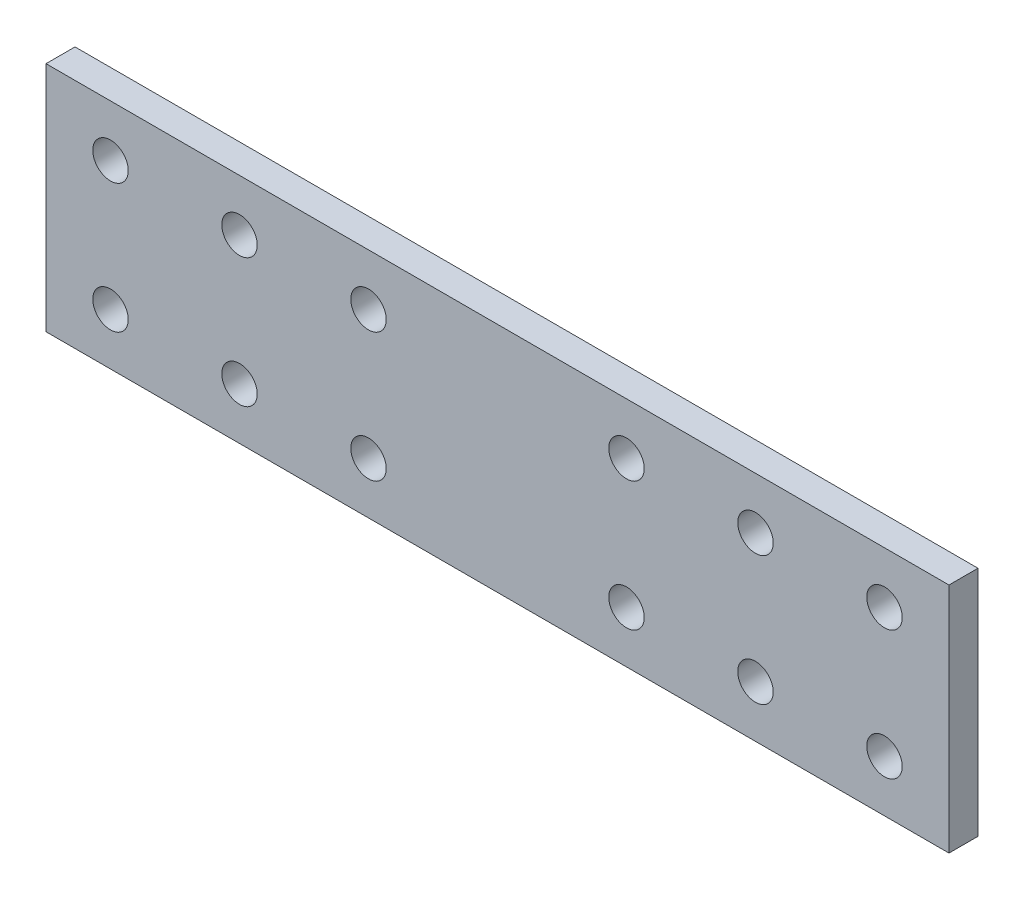
ISO-10303-21;
HEADER;
FILE_DESCRIPTION(('STEP AP214'),'2;1');
FILE_NAME('part.step','',(''),(''),'','','');
FILE_SCHEMA(('AUTOMOTIVE_DESIGN { 1 0 10303 214 1 1 1 1 }'));
ENDSEC;
DATA;
#1=APPLICATION_CONTEXT('core data for automotive mechanical design processes');
#2=APPLICATION_PROTOCOL_DEFINITION('international standard','automotive_design',2000,#1);
#3=PRODUCT_CONTEXT('',#1,'mechanical');
#4=PRODUCT('Part','Part','',(#3));
#5=PRODUCT_RELATED_PRODUCT_CATEGORY('part','',(#4));
#6=PRODUCT_DEFINITION_FORMATION('','',#4);
#7=PRODUCT_DEFINITION_CONTEXT('part definition',#1,'design');
#8=PRODUCT_DEFINITION('design','',#6,#7);
#9=PRODUCT_DEFINITION_SHAPE('','',#8);
#10=(LENGTH_UNIT() NAMED_UNIT(*) SI_UNIT(.MILLI.,.METRE.));
#11=(NAMED_UNIT(*) PLANE_ANGLE_UNIT() SI_UNIT($,.RADIAN.));
#12=(NAMED_UNIT(*) SI_UNIT($,.STERADIAN.) SOLID_ANGLE_UNIT());
#13=UNCERTAINTY_MEASURE_WITH_UNIT(LENGTH_MEASURE(1.E-05),#10,'distance_accuracy_value','');
#14=(GEOMETRIC_REPRESENTATION_CONTEXT(3) GLOBAL_UNCERTAINTY_ASSIGNED_CONTEXT((#13)) GLOBAL_UNIT_ASSIGNED_CONTEXT((#10,
#11,#12)) REPRESENTATION_CONTEXT('',''));
#15=CARTESIAN_POINT('',(0.,0.,0.));
#16=DIRECTION('',(0.,0.,1.));
#17=DIRECTION('',(1.,0.,0.));
#18=AXIS2_PLACEMENT_3D('',#15,#16,#17);
#19=CARTESIAN_POINT('',(0.,0.,18.));
#20=DIRECTION('',(1.,0.,0.));
#21=DIRECTION('',(0.,0.,-1.));
#22=AXIS2_PLACEMENT_3D('',#19,#20,#21);
#23=PLANE('',#22);
#24=DIRECTION('',(0.,-1.,0.));
#25=VECTOR('',#24,1.);
#26=CARTESIAN_POINT('',(0.,0.,0.));
#27=LINE('',#26,#25);
#28=CARTESIAN_POINT('',(0.,144.,0.));
#29=VERTEX_POINT('',#28);
#30=CARTESIAN_POINT('',(0.,0.,0.));
#31=VERTEX_POINT('',#30);
#32=EDGE_CURVE('E103',#29,#31,#27,.T.);
#33=ORIENTED_EDGE('',*,*,#32,.T.);
#34=DIRECTION('',(0.,0.,-1.));
#35=VECTOR('',#34,1.);
#36=CARTESIAN_POINT('',(0.,0.,18.));
#37=LINE('',#36,#35);
#38=CARTESIAN_POINT('',(0.,0.,18.));
#39=VERTEX_POINT('',#38);
#40=EDGE_CURVE('E94',#39,#31,#37,.T.);
#41=ORIENTED_EDGE('',*,*,#40,.F.);
#42=DIRECTION('',(0.,-1.,0.));
#43=VECTOR('',#42,1.);
#44=CARTESIAN_POINT('',(0.,0.,18.));
#45=LINE('',#44,#43);
#46=CARTESIAN_POINT('',(0.,144.,18.));
#47=VERTEX_POINT('',#46);
#48=EDGE_CURVE('E88',#47,#39,#45,.T.);
#49=ORIENTED_EDGE('',*,*,#48,.F.);
#50=DIRECTION('',(0.,0.,-1.));
#51=VECTOR('',#50,1.);
#52=CARTESIAN_POINT('',(0.,144.,18.));
#53=LINE('',#52,#51);
#54=EDGE_CURVE('E99',#47,#29,#53,.T.);
#55=ORIENTED_EDGE('',*,*,#54,.T.);
#56=EDGE_LOOP('',(#33,#41,#49,#55));
#57=FACE_BOUND('',#56,.T.);
#58=ADVANCED_FACE('F34',(#57),#23,.F.);
#59=CARTESIAN_POINT('',(0.,0.,18.));
#60=DIRECTION('',(0.,1.,0.));
#61=DIRECTION('',(0.,0.,1.));
#62=AXIS2_PLACEMENT_3D('',#59,#60,#61);
#63=PLANE('',#62);
#64=DIRECTION('',(1.,0.,0.));
#65=VECTOR('',#64,1.);
#66=CARTESIAN_POINT('',(0.,0.,0.));
#67=LINE('',#66,#65);
#68=CARTESIAN_POINT('',(560.,0.,0.));
#69=VERTEX_POINT('',#68);
#70=EDGE_CURVE('E93',#31,#69,#67,.T.);
#71=ORIENTED_EDGE('',*,*,#70,.T.);
#72=DIRECTION('',(0.,0.,-1.));
#73=VECTOR('',#72,1.);
#74=CARTESIAN_POINT('',(560.,0.,18.));
#75=LINE('',#74,#73);
#76=CARTESIAN_POINT('',(560.,0.,18.));
#77=VERTEX_POINT('',#76);
#78=EDGE_CURVE('E91',#77,#69,#75,.T.);
#79=ORIENTED_EDGE('',*,*,#78,.F.);
#80=DIRECTION('',(1.,0.,0.));
#81=VECTOR('',#80,1.);
#82=CARTESIAN_POINT('',(0.,0.,18.));
#83=LINE('',#82,#81);
#84=EDGE_CURVE('E82',#39,#77,#83,.T.);
#85=ORIENTED_EDGE('',*,*,#84,.F.);
#86=ORIENTED_EDGE('',*,*,#40,.T.);
#87=EDGE_LOOP('',(#71,#79,#85,#86));
#88=FACE_BOUND('',#87,.T.);
#89=ADVANCED_FACE('F92',(#88),#63,.F.);
#90=CARTESIAN_POINT('',(560.,0.,18.));
#91=DIRECTION('',(-1.,0.,0.));
#92=DIRECTION('',(0.,0.,1.));
#93=AXIS2_PLACEMENT_3D('',#90,#91,#92);
#94=PLANE('',#93);
#95=DIRECTION('',(0.,1.,0.));
#96=VECTOR('',#95,1.);
#97=CARTESIAN_POINT('',(560.,0.,0.));
#98=LINE('',#97,#96);
#99=CARTESIAN_POINT('',(560.,144.,0.));
#100=VERTEX_POINT('',#99);
#101=EDGE_CURVE('E68',#69,#100,#98,.T.);
#102=ORIENTED_EDGE('',*,*,#101,.T.);
#103=DIRECTION('',(0.,0.,-1.));
#104=VECTOR('',#103,1.);
#105=CARTESIAN_POINT('',(560.,144.,18.));
#106=LINE('',#105,#104);
#107=CARTESIAN_POINT('',(560.,144.,18.));
#108=VERTEX_POINT('',#107);
#109=EDGE_CURVE('E95',#108,#100,#106,.T.);
#110=ORIENTED_EDGE('',*,*,#109,.F.);
#111=DIRECTION('',(0.,1.,0.));
#112=VECTOR('',#111,1.);
#113=CARTESIAN_POINT('',(560.,0.,18.));
#114=LINE('',#113,#112);
#115=EDGE_CURVE('E86',#77,#108,#114,.T.);
#116=ORIENTED_EDGE('',*,*,#115,.F.);
#117=ORIENTED_EDGE('',*,*,#78,.T.);
#118=EDGE_LOOP('',(#102,#110,#116,#117));
#119=FACE_BOUND('',#118,.T.);
#120=ADVANCED_FACE('F97',(#119),#94,.F.);
#121=CARTESIAN_POINT('',(0.,144.,18.));
#122=DIRECTION('',(0.,-1.,0.));
#123=DIRECTION('',(0.,0.,-1.));
#124=AXIS2_PLACEMENT_3D('',#121,#122,#123);
#125=PLANE('',#124);
#126=DIRECTION('',(-1.,0.,0.));
#127=VECTOR('',#126,1.);
#128=CARTESIAN_POINT('',(0.,144.,0.));
#129=LINE('',#128,#127);
#130=EDGE_CURVE('E74',#100,#29,#129,.T.);
#131=ORIENTED_EDGE('',*,*,#130,.T.);
#132=ORIENTED_EDGE('',*,*,#54,.F.);
#133=DIRECTION('',(-1.,0.,0.));
#134=VECTOR('',#133,1.);
#135=CARTESIAN_POINT('',(0.,144.,18.));
#136=LINE('',#135,#134);
#137=EDGE_CURVE('E51',#108,#47,#136,.T.);
#138=ORIENTED_EDGE('',*,*,#137,.F.);
#139=ORIENTED_EDGE('',*,*,#109,.T.);
#140=EDGE_LOOP('',(#131,#132,#138,#139));
#141=FACE_BOUND('',#140,.T.);
#142=ADVANCED_FACE('F142',(#141),#125,.F.);
#143=CARTESIAN_POINT('',(0.,144.,18.));
#144=DIRECTION('',(0.,0.,-1.));
#145=DIRECTION('',(-1.,0.,0.));
#146=AXIS2_PLACEMENT_3D('',#143,#144,#145);
#147=PLANE('',#146);
#148=CARTESIAN_POINT('',(520.,32.,18.));
#149=DIRECTION('',(0.,0.,1.));
#150=DIRECTION('',(1.,0.,0.));
#151=AXIS2_PLACEMENT_3D('',#148,#149,#150);
#152=CIRCLE('',#151,11.);
#153=CARTESIAN_POINT('',(531.,32.,18.));
#154=VERTEX_POINT('',#153);
#155=EDGE_CURVE('E360',#154,#154,#152,.T.);
#156=ORIENTED_EDGE('',*,*,#155,.F.);
#157=EDGE_LOOP('',(#156));
#158=FACE_BOUND('',#157,.T.);
#159=CARTESIAN_POINT('',(440.,32.,18.));
#160=DIRECTION('',(0.,0.,1.));
#161=DIRECTION('',(1.,0.,0.));
#162=AXIS2_PLACEMENT_3D('',#159,#160,#161);
#163=CIRCLE('',#162,11.);
#164=CARTESIAN_POINT('',(451.,32.,18.));
#165=VERTEX_POINT('',#164);
#166=EDGE_CURVE('E354',#165,#165,#163,.T.);
#167=ORIENTED_EDGE('',*,*,#166,.F.);
#168=EDGE_LOOP('',(#167));
#169=FACE_BOUND('',#168,.T.);
#170=CARTESIAN_POINT('',(360.,32.,18.));
#171=DIRECTION('',(0.,0.,1.));
#172=DIRECTION('',(1.,0.,0.));
#173=AXIS2_PLACEMENT_3D('',#170,#171,#172);
#174=CIRCLE('',#173,11.);
#175=CARTESIAN_POINT('',(371.,32.,18.));
#176=VERTEX_POINT('',#175);
#177=EDGE_CURVE('E348',#176,#176,#174,.T.);
#178=ORIENTED_EDGE('',*,*,#177,.F.);
#179=EDGE_LOOP('',(#178));
#180=FACE_BOUND('',#179,.T.);
#181=CARTESIAN_POINT('',(520.,112.,18.));
#182=DIRECTION('',(0.,0.,1.));
#183=DIRECTION('',(1.,0.,0.));
#184=AXIS2_PLACEMENT_3D('',#181,#182,#183);
#185=CIRCLE('',#184,11.);
#186=CARTESIAN_POINT('',(531.,112.,18.));
#187=VERTEX_POINT('',#186);
#188=EDGE_CURVE('E342',#187,#187,#185,.T.);
#189=ORIENTED_EDGE('',*,*,#188,.F.);
#190=EDGE_LOOP('',(#189));
#191=FACE_BOUND('',#190,.T.);
#192=CARTESIAN_POINT('',(440.,112.,18.));
#193=DIRECTION('',(0.,0.,1.));
#194=DIRECTION('',(1.,0.,0.));
#195=AXIS2_PLACEMENT_3D('',#192,#193,#194);
#196=CIRCLE('',#195,11.);
#197=CARTESIAN_POINT('',(451.,112.,18.));
#198=VERTEX_POINT('',#197);
#199=EDGE_CURVE('E336',#198,#198,#196,.T.);
#200=ORIENTED_EDGE('',*,*,#199,.F.);
#201=EDGE_LOOP('',(#200));
#202=FACE_BOUND('',#201,.T.);
#203=CARTESIAN_POINT('',(360.,112.,18.));
#204=DIRECTION('',(0.,0.,1.));
#205=DIRECTION('',(1.,0.,0.));
#206=AXIS2_PLACEMENT_3D('',#203,#204,#205);
#207=CIRCLE('',#206,11.);
#208=CARTESIAN_POINT('',(371.,112.,18.));
#209=VERTEX_POINT('',#208);
#210=EDGE_CURVE('E330',#209,#209,#207,.T.);
#211=ORIENTED_EDGE('',*,*,#210,.F.);
#212=EDGE_LOOP('',(#211));
#213=FACE_BOUND('',#212,.T.);
#214=CARTESIAN_POINT('',(40.,32.,18.));
#215=DIRECTION('',(0.,0.,1.));
#216=DIRECTION('',(1.,0.,0.));
#217=AXIS2_PLACEMENT_3D('',#214,#215,#216);
#218=CIRCLE('',#217,11.);
#219=CARTESIAN_POINT('',(51.,32.,18.));
#220=VERTEX_POINT('',#219);
#221=EDGE_CURVE('E320',#220,#220,#218,.T.);
#222=ORIENTED_EDGE('',*,*,#221,.F.);
#223=EDGE_LOOP('',(#222));
#224=FACE_BOUND('',#223,.T.);
#225=CARTESIAN_POINT('',(40.,112.,18.));
#226=DIRECTION('',(0.,0.,1.));
#227=DIRECTION('',(1.,0.,0.));
#228=AXIS2_PLACEMENT_3D('',#225,#226,#227);
#229=CIRCLE('',#228,11.);
#230=CARTESIAN_POINT('',(51.,112.,18.));
#231=VERTEX_POINT('',#230);
#232=EDGE_CURVE('E318',#231,#231,#229,.T.);
#233=ORIENTED_EDGE('',*,*,#232,.F.);
#234=EDGE_LOOP('',(#233));
#235=FACE_BOUND('',#234,.T.);
#236=ORIENTED_EDGE('',*,*,#48,.T.);
#237=ORIENTED_EDGE('',*,*,#84,.T.);
#238=ORIENTED_EDGE('',*,*,#115,.T.);
#239=ORIENTED_EDGE('',*,*,#137,.T.);
#240=EDGE_LOOP('',(#236,#237,#238,#239));
#241=FACE_BOUND('',#240,.T.);
#242=CARTESIAN_POINT('',(120.,112.,18.));
#243=DIRECTION('',(0.,0.,1.));
#244=DIRECTION('',(1.,0.,0.));
#245=AXIS2_PLACEMENT_3D('',#242,#243,#244);
#246=CIRCLE('',#245,11.);
#247=CARTESIAN_POINT('',(131.,112.,18.));
#248=VERTEX_POINT('',#247);
#249=EDGE_CURVE('E116',#248,#248,#246,.T.);
#250=ORIENTED_EDGE('',*,*,#249,.F.);
#251=EDGE_LOOP('',(#250));
#252=FACE_BOUND('',#251,.T.);
#253=CARTESIAN_POINT('',(120.,32.,18.));
#254=DIRECTION('',(0.,0.,1.));
#255=DIRECTION('',(1.,0.,0.));
#256=AXIS2_PLACEMENT_3D('',#253,#254,#255);
#257=CIRCLE('',#256,11.);
#258=CARTESIAN_POINT('',(131.,32.,18.));
#259=VERTEX_POINT('',#258);
#260=EDGE_CURVE('E122',#259,#259,#257,.T.);
#261=ORIENTED_EDGE('',*,*,#260,.F.);
#262=EDGE_LOOP('',(#261));
#263=FACE_BOUND('',#262,.T.);
#264=CARTESIAN_POINT('',(200.,112.,18.));
#265=DIRECTION('',(0.,0.,1.));
#266=DIRECTION('',(1.,0.,0.));
#267=AXIS2_PLACEMENT_3D('',#264,#265,#266);
#268=CIRCLE('',#267,11.);
#269=CARTESIAN_POINT('',(211.,112.,18.));
#270=VERTEX_POINT('',#269);
#271=EDGE_CURVE('E128',#270,#270,#268,.T.);
#272=ORIENTED_EDGE('',*,*,#271,.F.);
#273=EDGE_LOOP('',(#272));
#274=FACE_BOUND('',#273,.T.);
#275=CARTESIAN_POINT('',(200.,32.,18.));
#276=DIRECTION('',(0.,0.,1.));
#277=DIRECTION('',(1.,0.,0.));
#278=AXIS2_PLACEMENT_3D('',#275,#276,#277);
#279=CIRCLE('',#278,11.);
#280=CARTESIAN_POINT('',(211.,32.,18.));
#281=VERTEX_POINT('',#280);
#282=EDGE_CURVE('E11',#281,#281,#279,.T.);
#283=ORIENTED_EDGE('',*,*,#282,.F.);
#284=EDGE_LOOP('',(#283));
#285=FACE_BOUND('',#284,.T.);
#286=ADVANCED_FACE('F83',(#158,#169,#180,#191,#202,#213,#224,#235,#241,#252,#263,#274,#285),
#147,.F.);
#287=CARTESIAN_POINT('',(0.,144.,0.));
#288=DIRECTION('',(0.,0.,-1.));
#289=DIRECTION('',(-1.,0.,0.));
#290=AXIS2_PLACEMENT_3D('',#287,#288,#289);
#291=PLANE('',#290);
#292=CARTESIAN_POINT('',(520.,32.,0.));
#293=DIRECTION('',(0.,0.,1.));
#294=DIRECTION('',(1.,0.,0.));
#295=AXIS2_PLACEMENT_3D('',#292,#293,#294);
#296=CIRCLE('',#295,11.);
#297=CARTESIAN_POINT('',(531.,32.,0.));
#298=VERTEX_POINT('',#297);
#299=EDGE_CURVE('E357',#298,#298,#296,.T.);
#300=ORIENTED_EDGE('',*,*,#299,.T.);
#301=EDGE_LOOP('',(#300));
#302=FACE_BOUND('',#301,.T.);
#303=CARTESIAN_POINT('',(440.,32.,0.));
#304=DIRECTION('',(0.,0.,1.));
#305=DIRECTION('',(1.,0.,0.));
#306=AXIS2_PLACEMENT_3D('',#303,#304,#305);
#307=CIRCLE('',#306,11.);
#308=CARTESIAN_POINT('',(451.,32.,0.));
#309=VERTEX_POINT('',#308);
#310=EDGE_CURVE('E351',#309,#309,#307,.T.);
#311=ORIENTED_EDGE('',*,*,#310,.T.);
#312=EDGE_LOOP('',(#311));
#313=FACE_BOUND('',#312,.T.);
#314=CARTESIAN_POINT('',(360.,32.,0.));
#315=DIRECTION('',(0.,0.,1.));
#316=DIRECTION('',(1.,0.,0.));
#317=AXIS2_PLACEMENT_3D('',#314,#315,#316);
#318=CIRCLE('',#317,11.);
#319=CARTESIAN_POINT('',(371.,32.,0.));
#320=VERTEX_POINT('',#319);
#321=EDGE_CURVE('E345',#320,#320,#318,.T.);
#322=ORIENTED_EDGE('',*,*,#321,.T.);
#323=EDGE_LOOP('',(#322));
#324=FACE_BOUND('',#323,.T.);
#325=CARTESIAN_POINT('',(520.,112.,0.));
#326=DIRECTION('',(0.,0.,1.));
#327=DIRECTION('',(1.,0.,0.));
#328=AXIS2_PLACEMENT_3D('',#325,#326,#327);
#329=CIRCLE('',#328,11.);
#330=CARTESIAN_POINT('',(531.,112.,0.));
#331=VERTEX_POINT('',#330);
#332=EDGE_CURVE('E339',#331,#331,#329,.T.);
#333=ORIENTED_EDGE('',*,*,#332,.T.);
#334=EDGE_LOOP('',(#333));
#335=FACE_BOUND('',#334,.T.);
#336=CARTESIAN_POINT('',(440.,112.,0.));
#337=DIRECTION('',(0.,0.,1.));
#338=DIRECTION('',(1.,0.,0.));
#339=AXIS2_PLACEMENT_3D('',#336,#337,#338);
#340=CIRCLE('',#339,11.);
#341=CARTESIAN_POINT('',(451.,112.,0.));
#342=VERTEX_POINT('',#341);
#343=EDGE_CURVE('E333',#342,#342,#340,.T.);
#344=ORIENTED_EDGE('',*,*,#343,.T.);
#345=EDGE_LOOP('',(#344));
#346=FACE_BOUND('',#345,.T.);
#347=CARTESIAN_POINT('',(360.,112.,0.));
#348=DIRECTION('',(0.,0.,1.));
#349=DIRECTION('',(1.,0.,0.));
#350=AXIS2_PLACEMENT_3D('',#347,#348,#349);
#351=CIRCLE('',#350,11.);
#352=CARTESIAN_POINT('',(371.,112.,0.));
#353=VERTEX_POINT('',#352);
#354=EDGE_CURVE('E329',#353,#353,#351,.T.);
#355=ORIENTED_EDGE('',*,*,#354,.T.);
#356=EDGE_LOOP('',(#355));
#357=FACE_BOUND('',#356,.T.);
#358=CARTESIAN_POINT('',(40.,32.,0.));
#359=DIRECTION('',(0.,0.,1.));
#360=DIRECTION('',(1.,0.,0.));
#361=AXIS2_PLACEMENT_3D('',#358,#359,#360);
#362=CIRCLE('',#361,11.);
#363=CARTESIAN_POINT('',(51.,32.,0.));
#364=VERTEX_POINT('',#363);
#365=EDGE_CURVE('E324',#364,#364,#362,.T.);
#366=ORIENTED_EDGE('',*,*,#365,.T.);
#367=EDGE_LOOP('',(#366));
#368=FACE_BOUND('',#367,.T.);
#369=CARTESIAN_POINT('',(40.,112.,0.));
#370=DIRECTION('',(0.,0.,1.));
#371=DIRECTION('',(1.,0.,0.));
#372=AXIS2_PLACEMENT_3D('',#369,#370,#371);
#373=CIRCLE('',#372,11.);
#374=CARTESIAN_POINT('',(51.,112.,0.));
#375=VERTEX_POINT('',#374);
#376=EDGE_CURVE('E106',#375,#375,#373,.T.);
#377=ORIENTED_EDGE('',*,*,#376,.T.);
#378=EDGE_LOOP('',(#377));
#379=FACE_BOUND('',#378,.T.);
#380=ORIENTED_EDGE('',*,*,#32,.F.);
#381=ORIENTED_EDGE('',*,*,#130,.F.);
#382=ORIENTED_EDGE('',*,*,#101,.F.);
#383=ORIENTED_EDGE('',*,*,#70,.F.);
#384=EDGE_LOOP('',(#380,#381,#382,#383));
#385=FACE_BOUND('',#384,.T.);
#386=CARTESIAN_POINT('',(120.,112.,0.));
#387=DIRECTION('',(0.,0.,1.));
#388=DIRECTION('',(1.,0.,0.));
#389=AXIS2_PLACEMENT_3D('',#386,#387,#388);
#390=CIRCLE('',#389,11.);
#391=CARTESIAN_POINT('',(131.,112.,0.));
#392=VERTEX_POINT('',#391);
#393=EDGE_CURVE('E113',#392,#392,#390,.T.);
#394=ORIENTED_EDGE('',*,*,#393,.T.);
#395=EDGE_LOOP('',(#394));
#396=FACE_BOUND('',#395,.T.);
#397=CARTESIAN_POINT('',(120.,32.,0.));
#398=DIRECTION('',(0.,0.,1.));
#399=DIRECTION('',(1.,0.,0.));
#400=AXIS2_PLACEMENT_3D('',#397,#398,#399);
#401=CIRCLE('',#400,11.);
#402=CARTESIAN_POINT('',(131.,32.,0.));
#403=VERTEX_POINT('',#402);
#404=EDGE_CURVE('E119',#403,#403,#401,.T.);
#405=ORIENTED_EDGE('',*,*,#404,.T.);
#406=EDGE_LOOP('',(#405));
#407=FACE_BOUND('',#406,.T.);
#408=CARTESIAN_POINT('',(200.,112.,0.));
#409=DIRECTION('',(0.,0.,1.));
#410=DIRECTION('',(1.,0.,0.));
#411=AXIS2_PLACEMENT_3D('',#408,#409,#410);
#412=CIRCLE('',#411,11.);
#413=CARTESIAN_POINT('',(211.,112.,0.));
#414=VERTEX_POINT('',#413);
#415=EDGE_CURVE('E125',#414,#414,#412,.T.);
#416=ORIENTED_EDGE('',*,*,#415,.T.);
#417=EDGE_LOOP('',(#416));
#418=FACE_BOUND('',#417,.T.);
#419=CARTESIAN_POINT('',(200.,32.,0.));
#420=DIRECTION('',(0.,0.,1.));
#421=DIRECTION('',(1.,0.,0.));
#422=AXIS2_PLACEMENT_3D('',#419,#420,#421);
#423=CIRCLE('',#422,11.);
#424=CARTESIAN_POINT('',(211.,32.,0.));
#425=VERTEX_POINT('',#424);
#426=EDGE_CURVE('E43',#425,#425,#423,.T.);
#427=ORIENTED_EDGE('',*,*,#426,.T.);
#428=EDGE_LOOP('',(#427));
#429=FACE_BOUND('',#428,.T.);
#430=ADVANCED_FACE('F133',(#302,#313,#324,#335,#346,#357,#368,#379,#385,#396,#407,#418,#429),
#291,.T.);
#431=CARTESIAN_POINT('',(40.,112.,0.));
#432=DIRECTION('',(0.,0.,1.));
#433=DIRECTION('',(1.,0.,0.));
#434=AXIS2_PLACEMENT_3D('',#431,#432,#433);
#435=CYLINDRICAL_SURFACE('',#434,11.);
#436=ORIENTED_EDGE('',*,*,#376,.F.);
#437=EDGE_LOOP('',(#436));
#438=FACE_BOUND('',#437,.T.);
#439=ORIENTED_EDGE('',*,*,#232,.T.);
#440=EDGE_LOOP('',(#439));
#441=FACE_BOUND('',#440,.T.);
#442=ADVANCED_FACE('F149',(#438,#441),#435,.F.);
#443=CARTESIAN_POINT('',(40.,32.,0.));
#444=DIRECTION('',(0.,0.,1.));
#445=DIRECTION('',(1.,0.,0.));
#446=AXIS2_PLACEMENT_3D('',#443,#444,#445);
#447=CYLINDRICAL_SURFACE('',#446,11.);
#448=ORIENTED_EDGE('',*,*,#365,.F.);
#449=EDGE_LOOP('',(#448));
#450=FACE_BOUND('',#449,.T.);
#451=ORIENTED_EDGE('',*,*,#221,.T.);
#452=EDGE_LOOP('',(#451));
#453=FACE_BOUND('',#452,.T.);
#454=ADVANCED_FACE('F169',(#450,#453),#447,.F.);
#455=CARTESIAN_POINT('',(120.,112.,0.));
#456=DIRECTION('',(0.,0.,1.));
#457=DIRECTION('',(1.,0.,0.));
#458=AXIS2_PLACEMENT_3D('',#455,#456,#457);
#459=CYLINDRICAL_SURFACE('',#458,11.);
#460=ORIENTED_EDGE('',*,*,#393,.F.);
#461=EDGE_LOOP('',(#460));
#462=FACE_BOUND('',#461,.T.);
#463=ORIENTED_EDGE('',*,*,#249,.T.);
#464=EDGE_LOOP('',(#463));
#465=FACE_BOUND('',#464,.T.);
#466=ADVANCED_FACE('F165',(#462,#465),#459,.F.);
#467=CARTESIAN_POINT('',(120.,32.,0.));
#468=DIRECTION('',(0.,0.,1.));
#469=DIRECTION('',(1.,0.,0.));
#470=AXIS2_PLACEMENT_3D('',#467,#468,#469);
#471=CYLINDRICAL_SURFACE('',#470,11.);
#472=ORIENTED_EDGE('',*,*,#404,.F.);
#473=EDGE_LOOP('',(#472));
#474=FACE_BOUND('',#473,.T.);
#475=ORIENTED_EDGE('',*,*,#260,.T.);
#476=EDGE_LOOP('',(#475));
#477=FACE_BOUND('',#476,.T.);
#478=ADVANCED_FACE('F168',(#474,#477),#471,.F.);
#479=CARTESIAN_POINT('',(200.,112.,0.));
#480=DIRECTION('',(0.,0.,1.));
#481=DIRECTION('',(1.,0.,0.));
#482=AXIS2_PLACEMENT_3D('',#479,#480,#481);
#483=CYLINDRICAL_SURFACE('',#482,11.);
#484=ORIENTED_EDGE('',*,*,#415,.F.);
#485=EDGE_LOOP('',(#484));
#486=FACE_BOUND('',#485,.T.);
#487=ORIENTED_EDGE('',*,*,#271,.T.);
#488=EDGE_LOOP('',(#487));
#489=FACE_BOUND('',#488,.T.);
#490=ADVANCED_FACE('F138',(#486,#489),#483,.F.);
#491=CARTESIAN_POINT('',(200.,32.,0.));
#492=DIRECTION('',(0.,0.,1.));
#493=DIRECTION('',(1.,0.,0.));
#494=AXIS2_PLACEMENT_3D('',#491,#492,#493);
#495=CYLINDRICAL_SURFACE('',#494,11.);
#496=ORIENTED_EDGE('',*,*,#426,.F.);
#497=EDGE_LOOP('',(#496));
#498=FACE_BOUND('',#497,.T.);
#499=ORIENTED_EDGE('',*,*,#282,.T.);
#500=EDGE_LOOP('',(#499));
#501=FACE_BOUND('',#500,.T.);
#502=ADVANCED_FACE('F36',(#498,#501),#495,.F.);
#503=CARTESIAN_POINT('',(360.,112.,0.));
#504=DIRECTION('',(0.,0.,1.));
#505=DIRECTION('',(1.,0.,0.));
#506=AXIS2_PLACEMENT_3D('',#503,#504,#505);
#507=CYLINDRICAL_SURFACE('',#506,11.);
#508=ORIENTED_EDGE('',*,*,#354,.F.);
#509=EDGE_LOOP('',(#508));
#510=FACE_BOUND('',#509,.T.);
#511=ORIENTED_EDGE('',*,*,#210,.T.);
#512=EDGE_LOOP('',(#511));
#513=FACE_BOUND('',#512,.T.);
#514=ADVANCED_FACE('F137',(#510,#513),#507,.F.);
#515=CARTESIAN_POINT('',(440.,112.,0.));
#516=DIRECTION('',(0.,0.,1.));
#517=DIRECTION('',(1.,0.,0.));
#518=AXIS2_PLACEMENT_3D('',#515,#516,#517);
#519=CYLINDRICAL_SURFACE('',#518,11.);
#520=ORIENTED_EDGE('',*,*,#343,.F.);
#521=EDGE_LOOP('',(#520));
#522=FACE_BOUND('',#521,.T.);
#523=ORIENTED_EDGE('',*,*,#199,.T.);
#524=EDGE_LOOP('',(#523));
#525=FACE_BOUND('',#524,.T.);
#526=ADVANCED_FACE('F194',(#522,#525),#519,.F.);
#527=CARTESIAN_POINT('',(520.,112.,0.));
#528=DIRECTION('',(0.,0.,1.));
#529=DIRECTION('',(1.,0.,0.));
#530=AXIS2_PLACEMENT_3D('',#527,#528,#529);
#531=CYLINDRICAL_SURFACE('',#530,11.);
#532=ORIENTED_EDGE('',*,*,#332,.F.);
#533=EDGE_LOOP('',(#532));
#534=FACE_BOUND('',#533,.T.);
#535=ORIENTED_EDGE('',*,*,#188,.T.);
#536=EDGE_LOOP('',(#535));
#537=FACE_BOUND('',#536,.T.);
#538=ADVANCED_FACE('F203',(#534,#537),#531,.F.);
#539=CARTESIAN_POINT('',(360.,32.,0.));
#540=DIRECTION('',(0.,0.,1.));
#541=DIRECTION('',(1.,0.,0.));
#542=AXIS2_PLACEMENT_3D('',#539,#540,#541);
#543=CYLINDRICAL_SURFACE('',#542,11.);
#544=ORIENTED_EDGE('',*,*,#321,.F.);
#545=EDGE_LOOP('',(#544));
#546=FACE_BOUND('',#545,.T.);
#547=ORIENTED_EDGE('',*,*,#177,.T.);
#548=EDGE_LOOP('',(#547));
#549=FACE_BOUND('',#548,.T.);
#550=ADVANCED_FACE('F211',(#546,#549),#543,.F.);
#551=CARTESIAN_POINT('',(440.,32.,0.));
#552=DIRECTION('',(0.,0.,1.));
#553=DIRECTION('',(1.,0.,0.));
#554=AXIS2_PLACEMENT_3D('',#551,#552,#553);
#555=CYLINDRICAL_SURFACE('',#554,11.);
#556=ORIENTED_EDGE('',*,*,#310,.F.);
#557=EDGE_LOOP('',(#556));
#558=FACE_BOUND('',#557,.T.);
#559=ORIENTED_EDGE('',*,*,#166,.T.);
#560=EDGE_LOOP('',(#559));
#561=FACE_BOUND('',#560,.T.);
#562=ADVANCED_FACE('F219',(#558,#561),#555,.F.);
#563=CARTESIAN_POINT('',(520.,32.,0.));
#564=DIRECTION('',(0.,0.,1.));
#565=DIRECTION('',(1.,0.,0.));
#566=AXIS2_PLACEMENT_3D('',#563,#564,#565);
#567=CYLINDRICAL_SURFACE('',#566,11.);
#568=ORIENTED_EDGE('',*,*,#299,.F.);
#569=EDGE_LOOP('',(#568));
#570=FACE_BOUND('',#569,.T.);
#571=ORIENTED_EDGE('',*,*,#155,.T.);
#572=EDGE_LOOP('',(#571));
#573=FACE_BOUND('',#572,.T.);
#574=ADVANCED_FACE('F227',(#570,#573),#567,.F.);
#575=CLOSED_SHELL('',(#58,#89,#120,#142,#286,#430,#442,#454,#466,#478,#490,#502,#514,#526,#538,
#550,#562,#574));
#576=MANIFOLD_SOLID_BREP('B2',#575);
#577=ADVANCED_BREP_SHAPE_REPRESENTATION('',(#18,#576),#14);
#578=SHAPE_DEFINITION_REPRESENTATION(#9,#577);
ENDSEC;
END-ISO-10303-21;
